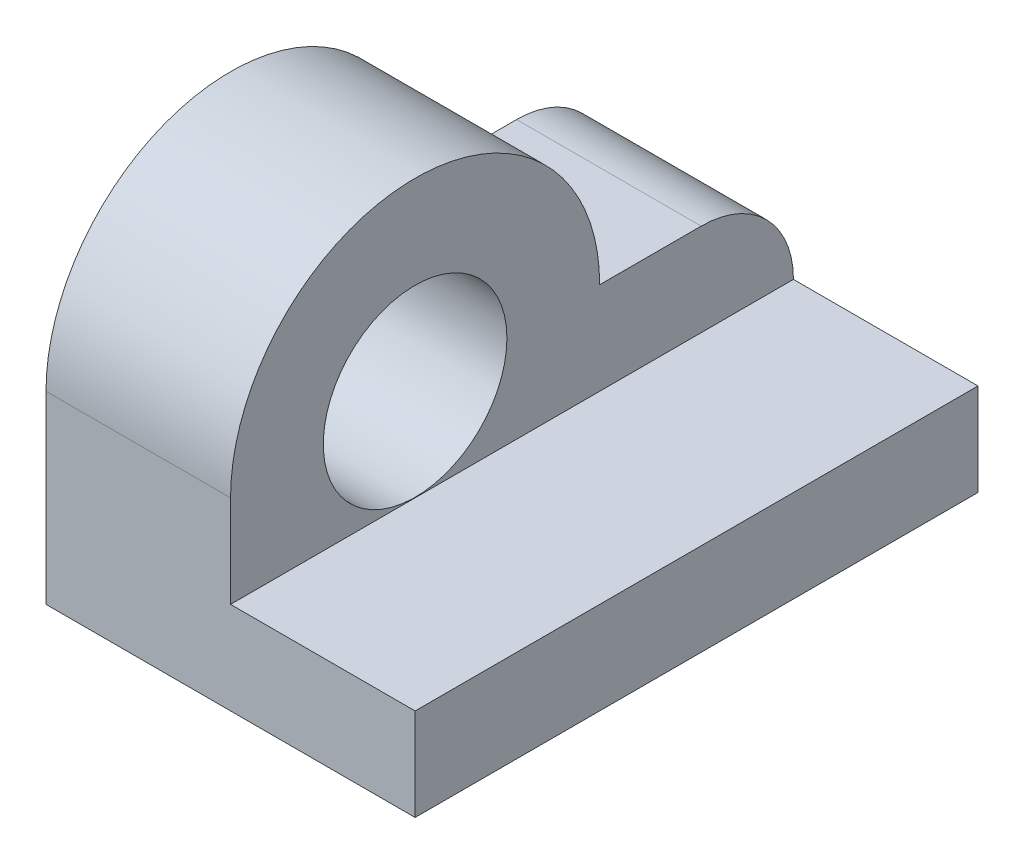
ISO-10303-21;
HEADER;
FILE_DESCRIPTION(('STEP AP214'),'2;1');
FILE_NAME('part.step','',(''),(''),'','','');
FILE_SCHEMA(('AUTOMOTIVE_DESIGN { 1 0 10303 214 1 1 1 1 }'));
ENDSEC;
DATA;
#1=APPLICATION_CONTEXT('core data for automotive mechanical design processes');
#2=APPLICATION_PROTOCOL_DEFINITION('international standard','automotive_design',2000,#1);
#3=PRODUCT_CONTEXT('',#1,'mechanical');
#4=PRODUCT('Part','Part','',(#3));
#5=PRODUCT_RELATED_PRODUCT_CATEGORY('part','',(#4));
#6=PRODUCT_DEFINITION_FORMATION('','',#4);
#7=PRODUCT_DEFINITION_CONTEXT('part definition',#1,'design');
#8=PRODUCT_DEFINITION('design','',#6,#7);
#9=PRODUCT_DEFINITION_SHAPE('','',#8);
#10=(LENGTH_UNIT() NAMED_UNIT(*) SI_UNIT(.MILLI.,.METRE.));
#11=(NAMED_UNIT(*) PLANE_ANGLE_UNIT() SI_UNIT($,.RADIAN.));
#12=(NAMED_UNIT(*) SI_UNIT($,.STERADIAN.) SOLID_ANGLE_UNIT());
#13=UNCERTAINTY_MEASURE_WITH_UNIT(LENGTH_MEASURE(1.E-05),#10,'distance_accuracy_value','');
#14=(GEOMETRIC_REPRESENTATION_CONTEXT(3) GLOBAL_UNCERTAINTY_ASSIGNED_CONTEXT((#13)) GLOBAL_UNIT_ASSIGNED_CONTEXT((#10,
#11,#12)) REPRESENTATION_CONTEXT('',''));
#15=CARTESIAN_POINT('',(0.,0.,0.));
#16=DIRECTION('',(0.,0.,1.));
#17=DIRECTION('',(1.,0.,0.));
#18=AXIS2_PLACEMENT_3D('',#15,#16,#17);
#19=CARTESIAN_POINT('',(0.,0.,-61.));
#20=DIRECTION('',(0.,0.,1.));
#21=DIRECTION('',(1.,0.,0.));
#22=AXIS2_PLACEMENT_3D('',#19,#20,#21);
#23=PLANE('',#22);
#24=DIRECTION('',(-1.,0.,0.));
#25=VECTOR('',#24,1.);
#26=CARTESIAN_POINT('',(103.990684678965,-10.,-61.));
#27=LINE('',#26,#25);
#28=CARTESIAN_POINT('',(0.,-10.,-61.));
#29=VERTEX_POINT('',#28);
#30=CARTESIAN_POINT('',(-20.,-10.,-61.));
#31=VERTEX_POINT('',#30);
#32=EDGE_CURVE('E106',#29,#31,#27,.T.);
#33=ORIENTED_EDGE('',*,*,#32,.F.);
#34=DIRECTION('',(-1.,0.,0.));
#35=VECTOR('',#34,1.);
#36=CARTESIAN_POINT('',(0.,-10.,-61.));
#37=LINE('',#36,#35);
#38=CARTESIAN_POINT('',(20.,-10.,-61.));
#39=VERTEX_POINT('',#38);
#40=EDGE_CURVE('E131',#39,#29,#37,.T.);
#41=ORIENTED_EDGE('',*,*,#40,.F.);
#42=DIRECTION('',(0.,1.,0.));
#43=VECTOR('',#42,1.);
#44=CARTESIAN_POINT('',(20.,-10.,-61.));
#45=LINE('',#44,#43);
#46=CARTESIAN_POINT('',(20.,-20.,-61.));
#47=VERTEX_POINT('',#46);
#48=EDGE_CURVE('E137',#47,#39,#45,.T.);
#49=ORIENTED_EDGE('',*,*,#48,.F.);
#50=DIRECTION('',(1.,0.,0.));
#51=VECTOR('',#50,1.);
#52=CARTESIAN_POINT('',(-20.,-20.,-61.));
#53=LINE('',#52,#51);
#54=CARTESIAN_POINT('',(-20.,-20.,-61.));
#55=VERTEX_POINT('',#54);
#56=EDGE_CURVE('E129',#55,#47,#53,.T.);
#57=ORIENTED_EDGE('',*,*,#56,.F.);
#58=DIRECTION('',(0.,-1.,0.));
#59=VECTOR('',#58,1.);
#60=CARTESIAN_POINT('',(-20.,20.,-61.));
#61=LINE('',#60,#59);
#62=EDGE_CURVE('E121',#31,#55,#61,.T.);
#63=ORIENTED_EDGE('',*,*,#62,.F.);
#64=EDGE_LOOP('',(#33,#41,#49,#57,#63));
#65=FACE_BOUND('',#64,.T.);
#66=ADVANCED_FACE('F43',(#65),#23,.F.);
#67=CARTESIAN_POINT('',(-20.,20.,-61.));
#68=DIRECTION('',(-1.,0.,0.));
#69=DIRECTION('',(0.,-1.,0.));
#70=AXIS2_PLACEMENT_3D('',#67,#68,#69);
#71=PLANE('',#70);
#72=CARTESIAN_POINT('',(-20.,0.,-20.));
#73=DIRECTION('',(1.,0.,0.));
#74=DIRECTION('',(0.,0.,-1.));
#75=AXIS2_PLACEMENT_3D('',#72,#73,#74);
#76=CIRCLE('',#75,9.95);
#77=CARTESIAN_POINT('',(-20.,0.,-29.95));
#78=VERTEX_POINT('',#77);
#79=EDGE_CURVE('E193',#78,#78,#76,.T.);
#80=ORIENTED_EDGE('',*,*,#79,.T.);
#81=EDGE_LOOP('',(#80));
#82=FACE_BOUND('',#81,.T.);
#83=CARTESIAN_POINT('',(-20.,-10.,-51.));
#84=DIRECTION('',(1.,0.,0.));
#85=DIRECTION('',(0.,0.,-1.));
#86=AXIS2_PLACEMENT_3D('',#83,#84,#85);
#87=CIRCLE('',#86,10.);
#88=CARTESIAN_POINT('',(-20.,0.,-51.));
#89=VERTEX_POINT('',#88);
#90=EDGE_CURVE('E61',#31,#89,#87,.T.);
#91=ORIENTED_EDGE('',*,*,#90,.F.);
#92=ORIENTED_EDGE('',*,*,#62,.T.);
#93=DIRECTION('',(0.,0.,1.));
#94=VECTOR('',#93,1.);
#95=CARTESIAN_POINT('',(-20.,-20.,-61.));
#96=LINE('',#95,#94);
#97=CARTESIAN_POINT('',(-20.,-20.,0.));
#98=VERTEX_POINT('',#97);
#99=EDGE_CURVE('E53',#55,#98,#96,.T.);
#100=ORIENTED_EDGE('',*,*,#99,.T.);
#101=DIRECTION('',(0.,-1.,0.));
#102=VECTOR('',#101,1.);
#103=CARTESIAN_POINT('',(-20.,20.,0.));
#104=LINE('',#103,#102);
#105=CARTESIAN_POINT('',(-20.,0.,0.));
#106=VERTEX_POINT('',#105);
#107=EDGE_CURVE('E154',#106,#98,#104,.T.);
#108=ORIENTED_EDGE('',*,*,#107,.F.);
#109=CARTESIAN_POINT('',(-20.,0.,-20.));
#110=DIRECTION('',(1.,0.,0.));
#111=DIRECTION('',(0.,0.,-1.));
#112=AXIS2_PLACEMENT_3D('',#109,#110,#111);
#113=CIRCLE('',#112,20.);
#114=CARTESIAN_POINT('',(-20.,0.,-40.));
#115=VERTEX_POINT('',#114);
#116=EDGE_CURVE('E69',#106,#115,#113,.F.);
#117=ORIENTED_EDGE('',*,*,#116,.T.);
#118=DIRECTION('',(0.,0.,-1.));
#119=VECTOR('',#118,1.);
#120=CARTESIAN_POINT('',(-20.,0.,-40.));
#121=LINE('',#120,#119);
#122=EDGE_CURVE('E123',#115,#89,#121,.T.);
#123=ORIENTED_EDGE('',*,*,#122,.T.);
#124=EDGE_LOOP('',(#91,#92,#100,#108,#117,#123));
#125=FACE_BOUND('',#124,.T.);
#126=ADVANCED_FACE('F119',(#82,#125),#71,.T.);
#127=CARTESIAN_POINT('',(128.990684678965,0.,-40.));
#128=DIRECTION('',(0.,1.,0.));
#129=DIRECTION('',(0.,0.,1.));
#130=AXIS2_PLACEMENT_3D('',#127,#128,#129);
#131=PLANE('',#130);
#132=DIRECTION('',(0.,0.,-1.));
#133=VECTOR('',#132,1.);
#134=CARTESIAN_POINT('',(0.,0.,-40.));
#135=LINE('',#134,#133);
#136=CARTESIAN_POINT('',(0.,0.,-40.));
#137=VERTEX_POINT('',#136);
#138=CARTESIAN_POINT('',(0.,0.,-51.));
#139=VERTEX_POINT('',#138);
#140=EDGE_CURVE('E146',#137,#139,#135,.T.);
#141=ORIENTED_EDGE('',*,*,#140,.T.);
#142=DIRECTION('',(-1.,0.,0.));
#143=VECTOR('',#142,1.);
#144=CARTESIAN_POINT('',(103.990684678965,0.,-51.));
#145=LINE('',#144,#143);
#146=EDGE_CURVE('E115',#139,#89,#145,.T.);
#147=ORIENTED_EDGE('',*,*,#146,.T.);
#148=ORIENTED_EDGE('',*,*,#122,.F.);
#149=DIRECTION('',(-1.,0.,0.));
#150=VECTOR('',#149,1.);
#151=CARTESIAN_POINT('',(128.990684678965,0.,-40.));
#152=LINE('',#151,#150);
#153=EDGE_CURVE('E186',#137,#115,#152,.T.);
#154=ORIENTED_EDGE('',*,*,#153,.F.);
#155=EDGE_LOOP('',(#141,#147,#148,#154));
#156=FACE_BOUND('',#155,.T.);
#157=ADVANCED_FACE('F208',(#156),#131,.T.);
#158=CARTESIAN_POINT('',(0.,0.,0.));
#159=DIRECTION('',(0.,0.,1.));
#160=DIRECTION('',(1.,0.,0.));
#161=AXIS2_PLACEMENT_3D('',#158,#159,#160);
#162=PLANE('',#161);
#163=DIRECTION('',(0.,1.,0.));
#164=VECTOR('',#163,1.);
#165=CARTESIAN_POINT('',(0.,20.,0.));
#166=LINE('',#165,#164);
#167=CARTESIAN_POINT('',(0.,-10.,0.));
#168=VERTEX_POINT('',#167);
#169=CARTESIAN_POINT('',(0.,0.,0.));
#170=VERTEX_POINT('',#169);
#171=EDGE_CURVE('E150',#168,#170,#166,.T.);
#172=ORIENTED_EDGE('',*,*,#171,.T.);
#173=DIRECTION('',(-1.,0.,0.));
#174=VECTOR('',#173,1.);
#175=CARTESIAN_POINT('',(128.990684678965,0.,0.));
#176=LINE('',#175,#174);
#177=EDGE_CURVE('E183',#170,#106,#176,.T.);
#178=ORIENTED_EDGE('',*,*,#177,.T.);
#179=ORIENTED_EDGE('',*,*,#107,.T.);
#180=DIRECTION('',(1.,0.,0.));
#181=VECTOR('',#180,1.);
#182=CARTESIAN_POINT('',(-20.,-20.,0.));
#183=LINE('',#182,#181);
#184=CARTESIAN_POINT('',(20.,-20.,0.));
#185=VERTEX_POINT('',#184);
#186=EDGE_CURVE('E157',#98,#185,#183,.T.);
#187=ORIENTED_EDGE('',*,*,#186,.T.);
#188=DIRECTION('',(0.,1.,0.));
#189=VECTOR('',#188,1.);
#190=CARTESIAN_POINT('',(20.,-10.,0.));
#191=LINE('',#190,#189);
#192=CARTESIAN_POINT('',(20.,-10.,0.));
#193=VERTEX_POINT('',#192);
#194=EDGE_CURVE('E141',#185,#193,#191,.T.);
#195=ORIENTED_EDGE('',*,*,#194,.T.);
#196=DIRECTION('',(-1.,0.,0.));
#197=VECTOR('',#196,1.);
#198=CARTESIAN_POINT('',(0.,-10.,0.));
#199=LINE('',#198,#197);
#200=EDGE_CURVE('E145',#193,#168,#199,.T.);
#201=ORIENTED_EDGE('',*,*,#200,.T.);
#202=EDGE_LOOP('',(#172,#178,#179,#187,#195,#201));
#203=FACE_BOUND('',#202,.T.);
#204=ADVANCED_FACE('F173',(#203),#162,.T.);
#205=CARTESIAN_POINT('',(20.,-10.,-61.));
#206=DIRECTION('',(1.,0.,0.));
#207=DIRECTION('',(0.,0.,-1.));
#208=AXIS2_PLACEMENT_3D('',#205,#206,#207);
#209=PLANE('',#208);
#210=ORIENTED_EDGE('',*,*,#194,.F.);
#211=DIRECTION('',(0.,0.,1.));
#212=VECTOR('',#211,1.);
#213=CARTESIAN_POINT('',(20.,-20.,-61.));
#214=LINE('',#213,#212);
#215=EDGE_CURVE('E11',#47,#185,#214,.T.);
#216=ORIENTED_EDGE('',*,*,#215,.F.);
#217=ORIENTED_EDGE('',*,*,#48,.T.);
#218=DIRECTION('',(0.,0.,1.));
#219=VECTOR('',#218,1.);
#220=CARTESIAN_POINT('',(20.,-10.,-61.));
#221=LINE('',#220,#219);
#222=EDGE_CURVE('E47',#39,#193,#221,.T.);
#223=ORIENTED_EDGE('',*,*,#222,.T.);
#224=EDGE_LOOP('',(#210,#216,#217,#223));
#225=FACE_BOUND('',#224,.T.);
#226=ADVANCED_FACE('F45',(#225),#209,.T.);
#227=CARTESIAN_POINT('',(-20.,-20.,-61.));
#228=DIRECTION('',(0.,-1.,0.));
#229=DIRECTION('',(0.,0.,-1.));
#230=AXIS2_PLACEMENT_3D('',#227,#228,#229);
#231=PLANE('',#230);
#232=ORIENTED_EDGE('',*,*,#186,.F.);
#233=ORIENTED_EDGE('',*,*,#99,.F.);
#234=ORIENTED_EDGE('',*,*,#56,.T.);
#235=ORIENTED_EDGE('',*,*,#215,.T.);
#236=EDGE_LOOP('',(#232,#233,#234,#235));
#237=FACE_BOUND('',#236,.T.);
#238=ADVANCED_FACE('F177',(#237),#231,.T.);
#239=CARTESIAN_POINT('',(0.,20.,-61.));
#240=DIRECTION('',(1.,0.,0.));
#241=DIRECTION('',(0.,0.,-1.));
#242=AXIS2_PLACEMENT_3D('',#239,#240,#241);
#243=PLANE('',#242);
#244=CARTESIAN_POINT('',(0.,0.,-20.));
#245=DIRECTION('',(1.,0.,0.));
#246=DIRECTION('',(0.,0.,-1.));
#247=AXIS2_PLACEMENT_3D('',#244,#245,#246);
#248=CIRCLE('',#247,9.95);
#249=CARTESIAN_POINT('',(0.,0.,-29.95));
#250=VERTEX_POINT('',#249);
#251=EDGE_CURVE('E197',#250,#250,#248,.T.);
#252=ORIENTED_EDGE('',*,*,#251,.F.);
#253=EDGE_LOOP('',(#252));
#254=FACE_BOUND('',#253,.T.);
#255=DIRECTION('',(0.,0.,1.));
#256=VECTOR('',#255,1.);
#257=CARTESIAN_POINT('',(0.,-10.,-61.));
#258=LINE('',#257,#256);
#259=EDGE_CURVE('E162',#29,#168,#258,.T.);
#260=ORIENTED_EDGE('',*,*,#259,.F.);
#261=CARTESIAN_POINT('',(0.,-10.,-51.));
#262=DIRECTION('',(1.,0.,0.));
#263=DIRECTION('',(0.,0.,-1.));
#264=AXIS2_PLACEMENT_3D('',#261,#262,#263);
#265=CIRCLE('',#264,10.);
#266=EDGE_CURVE('E109',#29,#139,#265,.T.);
#267=ORIENTED_EDGE('',*,*,#266,.T.);
#268=ORIENTED_EDGE('',*,*,#140,.F.);
#269=CARTESIAN_POINT('',(0.,0.,-20.));
#270=DIRECTION('',(1.,0.,0.));
#271=DIRECTION('',(0.,0.,-1.));
#272=AXIS2_PLACEMENT_3D('',#269,#270,#271);
#273=CIRCLE('',#272,20.);
#274=EDGE_CURVE('E180',#170,#137,#273,.F.);
#275=ORIENTED_EDGE('',*,*,#274,.F.);
#276=ORIENTED_EDGE('',*,*,#171,.F.);
#277=EDGE_LOOP('',(#260,#267,#268,#275,#276));
#278=FACE_BOUND('',#277,.T.);
#279=ADVANCED_FACE('F212',(#254,#278),#243,.T.);
#280=CARTESIAN_POINT('',(0.,-10.,-61.));
#281=DIRECTION('',(0.,1.,0.));
#282=DIRECTION('',(-1.,0.,0.));
#283=AXIS2_PLACEMENT_3D('',#280,#281,#282);
#284=PLANE('',#283);
#285=ORIENTED_EDGE('',*,*,#200,.F.);
#286=ORIENTED_EDGE('',*,*,#222,.F.);
#287=ORIENTED_EDGE('',*,*,#40,.T.);
#288=ORIENTED_EDGE('',*,*,#259,.T.);
#289=EDGE_LOOP('',(#285,#286,#287,#288));
#290=FACE_BOUND('',#289,.T.);
#291=ADVANCED_FACE('F171',(#290),#284,.T.);
#292=CARTESIAN_POINT('',(128.990684678965,0.,-20.));
#293=DIRECTION('',(-1.,0.,0.));
#294=DIRECTION('',(0.,0.,1.));
#295=AXIS2_PLACEMENT_3D('',#292,#293,#294);
#296=CYLINDRICAL_SURFACE('',#295,20.);
#297=ORIENTED_EDGE('',*,*,#274,.T.);
#298=ORIENTED_EDGE('',*,*,#153,.T.);
#299=ORIENTED_EDGE('',*,*,#116,.F.);
#300=ORIENTED_EDGE('',*,*,#177,.F.);
#301=EDGE_LOOP('',(#297,#298,#299,#300));
#302=FACE_BOUND('',#301,.T.);
#303=ADVANCED_FACE('F214',(#302),#296,.T.);
#304=CARTESIAN_POINT('',(-20.,0.,-20.));
#305=DIRECTION('',(1.,0.,0.));
#306=DIRECTION('',(0.,0.,-1.));
#307=AXIS2_PLACEMENT_3D('',#304,#305,#306);
#308=CYLINDRICAL_SURFACE('',#307,9.95);
#309=ORIENTED_EDGE('',*,*,#79,.F.);
#310=EDGE_LOOP('',(#309));
#311=FACE_BOUND('',#310,.T.);
#312=ORIENTED_EDGE('',*,*,#251,.T.);
#313=EDGE_LOOP('',(#312));
#314=FACE_BOUND('',#313,.T.);
#315=ADVANCED_FACE('F216',(#311,#314),#308,.F.);
#316=CARTESIAN_POINT('',(103.990684678965,-10.,-51.));
#317=DIRECTION('',(-1.,0.,0.));
#318=DIRECTION('',(0.,0.,1.));
#319=AXIS2_PLACEMENT_3D('',#316,#317,#318);
#320=CYLINDRICAL_SURFACE('',#319,10.);
#321=ORIENTED_EDGE('',*,*,#32,.T.);
#322=ORIENTED_EDGE('',*,*,#90,.T.);
#323=ORIENTED_EDGE('',*,*,#146,.F.);
#324=ORIENTED_EDGE('',*,*,#266,.F.);
#325=EDGE_LOOP('',(#321,#322,#323,#324));
#326=FACE_BOUND('',#325,.T.);
#327=ADVANCED_FACE('F107',(#326),#320,.T.);
#328=CLOSED_SHELL('',(#66,#126,#157,#204,#226,#238,#279,#291,#303,#315,#327));
#329=MANIFOLD_SOLID_BREP('B2',#328);
#330=ADVANCED_BREP_SHAPE_REPRESENTATION('',(#18,#329),#14);
#331=SHAPE_DEFINITION_REPRESENTATION(#9,#330);
ENDSEC;
END-ISO-10303-21;
